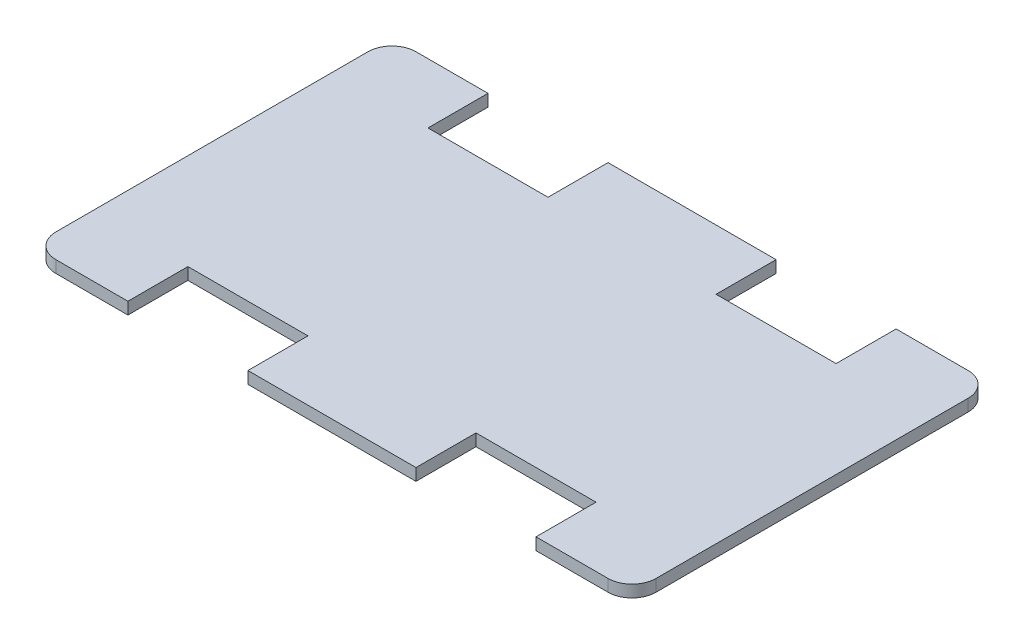
ISO-10303-21;
HEADER;
FILE_DESCRIPTION(('STEP AP214'),'2;1');
FILE_NAME('part.step','',(''),(''),'','','');
FILE_SCHEMA(('AUTOMOTIVE_DESIGN { 1 0 10303 214 1 1 1 1 }'));
ENDSEC;
DATA;
#1=APPLICATION_CONTEXT('core data for automotive mechanical design processes');
#2=APPLICATION_PROTOCOL_DEFINITION('international standard','automotive_design',2000,#1);
#3=PRODUCT_CONTEXT('',#1,'mechanical');
#4=PRODUCT('Part','Part','',(#3));
#5=PRODUCT_RELATED_PRODUCT_CATEGORY('part','',(#4));
#6=PRODUCT_DEFINITION_FORMATION('','',#4);
#7=PRODUCT_DEFINITION_CONTEXT('part definition',#1,'design');
#8=PRODUCT_DEFINITION('design','',#6,#7);
#9=PRODUCT_DEFINITION_SHAPE('','',#8);
#10=(LENGTH_UNIT() NAMED_UNIT(*) SI_UNIT(.MILLI.,.METRE.));
#11=(NAMED_UNIT(*) PLANE_ANGLE_UNIT() SI_UNIT($,.RADIAN.));
#12=(NAMED_UNIT(*) SI_UNIT($,.STERADIAN.) SOLID_ANGLE_UNIT());
#13=UNCERTAINTY_MEASURE_WITH_UNIT(LENGTH_MEASURE(1.E-05),#10,'distance_accuracy_value','');
#14=(GEOMETRIC_REPRESENTATION_CONTEXT(3) GLOBAL_UNCERTAINTY_ASSIGNED_CONTEXT((#13)) GLOBAL_UNIT_ASSIGNED_CONTEXT((#10,
#11,#12)) REPRESENTATION_CONTEXT('',''));
#15=CARTESIAN_POINT('',(0.,0.,0.));
#16=DIRECTION('',(0.,0.,1.));
#17=DIRECTION('',(1.,0.,0.));
#18=AXIS2_PLACEMENT_3D('',#15,#16,#17);
#19=CARTESIAN_POINT('',(-105.729613733906,5.,-57.5107296137339));
#20=DIRECTION('',(-1.,0.,0.));
#21=DIRECTION('',(0.,0.,1.));
#22=AXIS2_PLACEMENT_3D('',#19,#20,#21);
#23=PLANE('',#22);
#24=DIRECTION('',(0.,0.,-1.));
#25=VECTOR('',#24,1.);
#26=CARTESIAN_POINT('',(-105.729613733906,0.,-57.5107296137339));
#27=LINE('',#26,#25);
#28=CARTESIAN_POINT('',(-105.729613733906,0.,-32.5107296137339));
#29=VERTEX_POINT('',#28);
#30=CARTESIAN_POINT('',(-105.729613733906,0.,-57.5107296137339));
#31=VERTEX_POINT('',#30);
#32=EDGE_CURVE('E242',#29,#31,#27,.T.);
#33=ORIENTED_EDGE('',*,*,#32,.T.);
#34=DIRECTION('',(0.,-1.,0.));
#35=VECTOR('',#34,1.);
#36=CARTESIAN_POINT('',(-105.729613733906,5.,-57.5107296137339));
#37=LINE('',#36,#35);
#38=CARTESIAN_POINT('',(-105.729613733906,5.,-57.5107296137339));
#39=VERTEX_POINT('',#38);
#40=EDGE_CURVE('E11',#39,#31,#37,.T.);
#41=ORIENTED_EDGE('',*,*,#40,.F.);
#42=DIRECTION('',(0.,0.,-1.));
#43=VECTOR('',#42,1.);
#44=CARTESIAN_POINT('',(-105.729613733906,5.,-57.5107296137339));
#45=LINE('',#44,#43);
#46=CARTESIAN_POINT('',(-105.729613733906,5.,-32.5107296137339));
#47=VERTEX_POINT('',#46);
#48=EDGE_CURVE('E312',#47,#39,#45,.T.);
#49=ORIENTED_EDGE('',*,*,#48,.F.);
#50=DIRECTION('',(0.,-1.,0.));
#51=VECTOR('',#50,1.);
#52=CARTESIAN_POINT('',(-105.729613733906,5.,-32.5107296137339));
#53=LINE('',#52,#51);
#54=EDGE_CURVE('E238',#47,#29,#53,.T.);
#55=ORIENTED_EDGE('',*,*,#54,.T.);
#56=EDGE_LOOP('',(#33,#41,#49,#55));
#57=FACE_BOUND('',#56,.T.);
#58=ADVANCED_FACE('F45',(#57),#23,.F.);
#59=CARTESIAN_POINT('',(-135.729613733905,5.,-57.5107296137339));
#60=DIRECTION('',(0.,0.,1.));
#61=DIRECTION('',(1.,0.,0.));
#62=AXIS2_PLACEMENT_3D('',#59,#60,#61);
#63=PLANE('',#62);
#64=DIRECTION('',(-1.,0.,0.));
#65=VECTOR('',#64,1.);
#66=CARTESIAN_POINT('',(-135.729613733905,0.,-57.5107296137339));
#67=LINE('',#66,#65);
#68=CARTESIAN_POINT('',(-135.729613733905,0.,-57.5107296137339));
#69=VERTEX_POINT('',#68);
#70=EDGE_CURVE('E246',#31,#69,#67,.T.);
#71=ORIENTED_EDGE('',*,*,#70,.T.);
#72=DIRECTION('',(0.,-1.,0.));
#73=VECTOR('',#72,1.);
#74=CARTESIAN_POINT('',(-135.729613733905,5.,-57.5107296137339));
#75=LINE('',#74,#73);
#76=CARTESIAN_POINT('',(-135.729613733905,5.,-57.5107296137339));
#77=VERTEX_POINT('',#76);
#78=EDGE_CURVE('E54',#77,#69,#75,.T.);
#79=ORIENTED_EDGE('',*,*,#78,.F.);
#80=DIRECTION('',(-1.,0.,0.));
#81=VECTOR('',#80,1.);
#82=CARTESIAN_POINT('',(-135.729613733905,5.,-57.5107296137339));
#83=LINE('',#82,#81);
#84=EDGE_CURVE('E153',#39,#77,#83,.T.);
#85=ORIENTED_EDGE('',*,*,#84,.F.);
#86=ORIENTED_EDGE('',*,*,#40,.T.);
#87=EDGE_LOOP('',(#71,#79,#85,#86));
#88=FACE_BOUND('',#87,.T.);
#89=ADVANCED_FACE('F490',(#88),#63,.F.);
#90=CARTESIAN_POINT('',(-135.729613733906,5.,-47.5107296137339));
#91=DIRECTION('',(0.,-1.,0.));
#92=DIRECTION('',(0.,0.,-1.));
#93=AXIS2_PLACEMENT_3D('',#90,#91,#92);
#94=CYLINDRICAL_SURFACE('',#93,10.);
#95=CARTESIAN_POINT('',(-135.729613733906,0.,-47.5107296137339));
#96=DIRECTION('',(0.,1.,0.));
#97=DIRECTION('',(0.,0.,-1.));
#98=AXIS2_PLACEMENT_3D('',#95,#96,#97);
#99=CIRCLE('',#98,10.);
#100=CARTESIAN_POINT('',(-145.729613733906,0.,-47.5107296137338));
#101=VERTEX_POINT('',#100);
#102=EDGE_CURVE('E249',#69,#101,#99,.T.);
#103=ORIENTED_EDGE('',*,*,#102,.T.);
#104=DIRECTION('',(0.,-1.,0.));
#105=VECTOR('',#104,1.);
#106=CARTESIAN_POINT('',(-145.729613733906,5.,-47.5107296137338));
#107=LINE('',#106,#105);
#108=CARTESIAN_POINT('',(-145.729613733906,5.,-47.5107296137338));
#109=VERTEX_POINT('',#108);
#110=EDGE_CURVE('E387',#109,#101,#107,.T.);
#111=ORIENTED_EDGE('',*,*,#110,.F.);
#112=CARTESIAN_POINT('',(-135.729613733906,5.,-47.5107296137339));
#113=DIRECTION('',(0.,1.,0.));
#114=DIRECTION('',(0.,0.,-1.));
#115=AXIS2_PLACEMENT_3D('',#112,#113,#114);
#116=CIRCLE('',#115,10.);
#117=EDGE_CURVE('E397',#77,#109,#116,.T.);
#118=ORIENTED_EDGE('',*,*,#117,.F.);
#119=ORIENTED_EDGE('',*,*,#78,.T.);
#120=EDGE_LOOP('',(#103,#111,#118,#119));
#121=FACE_BOUND('',#120,.T.);
#122=ADVANCED_FACE('F395',(#121),#94,.T.);
#123=CARTESIAN_POINT('',(-145.729613733906,5.,-47.5107296137339));
#124=DIRECTION('',(1.,0.,0.));
#125=DIRECTION('',(0.,0.,-1.));
#126=AXIS2_PLACEMENT_3D('',#123,#124,#125);
#127=PLANE('',#126);
#128=DIRECTION('',(0.,0.,1.));
#129=VECTOR('',#128,1.);
#130=CARTESIAN_POINT('',(-145.729613733906,0.,-47.5107296137339));
#131=LINE('',#130,#129);
#132=CARTESIAN_POINT('',(-145.729613733906,0.,82.489270386266));
#133=VERTEX_POINT('',#132);
#134=EDGE_CURVE('E252',#101,#133,#131,.T.);
#135=ORIENTED_EDGE('',*,*,#134,.T.);
#136=DIRECTION('',(0.,-1.,0.));
#137=VECTOR('',#136,1.);
#138=CARTESIAN_POINT('',(-145.729613733906,5.,82.489270386266));
#139=LINE('',#138,#137);
#140=CARTESIAN_POINT('',(-145.729613733906,5.,82.489270386266));
#141=VERTEX_POINT('',#140);
#142=EDGE_CURVE('E383',#141,#133,#139,.T.);
#143=ORIENTED_EDGE('',*,*,#142,.F.);
#144=DIRECTION('',(0.,0.,1.));
#145=VECTOR('',#144,1.);
#146=CARTESIAN_POINT('',(-145.729613733906,5.,-47.5107296137339));
#147=LINE('',#146,#145);
#148=EDGE_CURVE('E416',#109,#141,#147,.T.);
#149=ORIENTED_EDGE('',*,*,#148,.F.);
#150=ORIENTED_EDGE('',*,*,#110,.T.);
#151=EDGE_LOOP('',(#135,#143,#149,#150));
#152=FACE_BOUND('',#151,.T.);
#153=ADVANCED_FACE('F406',(#152),#127,.F.);
#154=CARTESIAN_POINT('',(-135.729613733906,5.,82.4892703862661));
#155=DIRECTION('',(0.,-1.,0.));
#156=DIRECTION('',(0.,0.,-1.));
#157=AXIS2_PLACEMENT_3D('',#154,#155,#156);
#158=CYLINDRICAL_SURFACE('',#157,10.);
#159=CARTESIAN_POINT('',(-135.729613733906,0.,82.4892703862661));
#160=DIRECTION('',(0.,1.,0.));
#161=DIRECTION('',(0.,0.,1.));
#162=AXIS2_PLACEMENT_3D('',#159,#160,#161);
#163=CIRCLE('',#162,10.);
#164=CARTESIAN_POINT('',(-135.729613733906,0.,92.4892703862661));
#165=VERTEX_POINT('',#164);
#166=EDGE_CURVE('E255',#133,#165,#163,.T.);
#167=ORIENTED_EDGE('',*,*,#166,.T.);
#168=DIRECTION('',(0.,-1.,0.));
#169=VECTOR('',#168,1.);
#170=CARTESIAN_POINT('',(-135.729613733906,5.,92.4892703862661));
#171=LINE('',#170,#169);
#172=CARTESIAN_POINT('',(-135.729613733906,5.,92.4892703862661));
#173=VERTEX_POINT('',#172);
#174=EDGE_CURVE('E379',#173,#165,#171,.T.);
#175=ORIENTED_EDGE('',*,*,#174,.F.);
#176=CARTESIAN_POINT('',(-135.729613733906,5.,82.4892703862661));
#177=DIRECTION('',(0.,1.,0.));
#178=DIRECTION('',(0.,0.,1.));
#179=AXIS2_PLACEMENT_3D('',#176,#177,#178);
#180=CIRCLE('',#179,10.);
#181=EDGE_CURVE('E412',#141,#173,#180,.T.);
#182=ORIENTED_EDGE('',*,*,#181,.F.);
#183=ORIENTED_EDGE('',*,*,#142,.T.);
#184=EDGE_LOOP('',(#167,#175,#182,#183));
#185=FACE_BOUND('',#184,.T.);
#186=ADVANCED_FACE('F410',(#185),#158,.T.);
#187=CARTESIAN_POINT('',(-135.729613733905,5.,92.4892703862661));
#188=DIRECTION('',(0.,0.,-1.));
#189=DIRECTION('',(-1.,0.,0.));
#190=AXIS2_PLACEMENT_3D('',#187,#188,#189);
#191=PLANE('',#190);
#192=DIRECTION('',(1.,0.,0.));
#193=VECTOR('',#192,1.);
#194=CARTESIAN_POINT('',(-135.729613733905,0.,92.4892703862661));
#195=LINE('',#194,#193);
#196=CARTESIAN_POINT('',(-105.729613733906,0.,92.4892703862661));
#197=VERTEX_POINT('',#196);
#198=EDGE_CURVE('E258',#165,#197,#195,.T.);
#199=ORIENTED_EDGE('',*,*,#198,.T.);
#200=DIRECTION('',(0.,-1.,0.));
#201=VECTOR('',#200,1.);
#202=CARTESIAN_POINT('',(-105.729613733906,5.,92.4892703862661));
#203=LINE('',#202,#201);
#204=CARTESIAN_POINT('',(-105.729613733906,5.,92.4892703862661));
#205=VERTEX_POINT('',#204);
#206=EDGE_CURVE('E375',#205,#197,#203,.T.);
#207=ORIENTED_EDGE('',*,*,#206,.F.);
#208=DIRECTION('',(1.,0.,0.));
#209=VECTOR('',#208,1.);
#210=CARTESIAN_POINT('',(-135.729613733905,5.,92.4892703862661));
#211=LINE('',#210,#209);
#212=EDGE_CURVE('E415',#173,#205,#211,.T.);
#213=ORIENTED_EDGE('',*,*,#212,.F.);
#214=ORIENTED_EDGE('',*,*,#174,.T.);
#215=EDGE_LOOP('',(#199,#207,#213,#214));
#216=FACE_BOUND('',#215,.T.);
#217=ADVANCED_FACE('F503',(#216),#191,.F.);
#218=CARTESIAN_POINT('',(-105.729613733906,5.,67.4892703862661));
#219=DIRECTION('',(-1.,0.,0.));
#220=DIRECTION('',(0.,0.,1.));
#221=AXIS2_PLACEMENT_3D('',#218,#219,#220);
#222=PLANE('',#221);
#223=DIRECTION('',(0.,0.,-1.));
#224=VECTOR('',#223,1.);
#225=CARTESIAN_POINT('',(-105.729613733906,0.,67.4892703862661));
#226=LINE('',#225,#224);
#227=CARTESIAN_POINT('',(-105.729613733906,0.,67.4892703862661));
#228=VERTEX_POINT('',#227);
#229=EDGE_CURVE('E261',#197,#228,#226,.T.);
#230=ORIENTED_EDGE('',*,*,#229,.T.);
#231=DIRECTION('',(0.,-1.,0.));
#232=VECTOR('',#231,1.);
#233=CARTESIAN_POINT('',(-105.729613733906,5.,67.4892703862661));
#234=LINE('',#233,#232);
#235=CARTESIAN_POINT('',(-105.729613733906,5.,67.4892703862661));
#236=VERTEX_POINT('',#235);
#237=EDGE_CURVE('E371',#236,#228,#234,.T.);
#238=ORIENTED_EDGE('',*,*,#237,.F.);
#239=DIRECTION('',(0.,0.,-1.));
#240=VECTOR('',#239,1.);
#241=CARTESIAN_POINT('',(-105.729613733906,5.,67.4892703862661));
#242=LINE('',#241,#240);
#243=EDGE_CURVE('E420',#205,#236,#242,.T.);
#244=ORIENTED_EDGE('',*,*,#243,.F.);
#245=ORIENTED_EDGE('',*,*,#206,.T.);
#246=EDGE_LOOP('',(#230,#238,#244,#245));
#247=FACE_BOUND('',#246,.T.);
#248=ADVANCED_FACE('F506',(#247),#222,.F.);
#249=CARTESIAN_POINT('',(-105.729613733906,5.,67.4892703862661));
#250=DIRECTION('',(0.,0.,-1.));
#251=DIRECTION('',(-1.,0.,0.));
#252=AXIS2_PLACEMENT_3D('',#249,#250,#251);
#253=PLANE('',#252);
#254=DIRECTION('',(1.,0.,0.));
#255=VECTOR('',#254,1.);
#256=CARTESIAN_POINT('',(-105.729613733906,0.,67.4892703862661));
#257=LINE('',#256,#255);
#258=CARTESIAN_POINT('',(-55.7296137339055,0.,67.4892703862661));
#259=VERTEX_POINT('',#258);
#260=EDGE_CURVE('E264',#228,#259,#257,.T.);
#261=ORIENTED_EDGE('',*,*,#260,.T.);
#262=DIRECTION('',(0.,-1.,0.));
#263=VECTOR('',#262,1.);
#264=CARTESIAN_POINT('',(-55.7296137339055,5.,67.4892703862661));
#265=LINE('',#264,#263);
#266=CARTESIAN_POINT('',(-55.7296137339055,5.,67.4892703862661));
#267=VERTEX_POINT('',#266);
#268=EDGE_CURVE('E367',#267,#259,#265,.T.);
#269=ORIENTED_EDGE('',*,*,#268,.F.);
#270=DIRECTION('',(1.,0.,0.));
#271=VECTOR('',#270,1.);
#272=CARTESIAN_POINT('',(-105.729613733906,5.,67.4892703862661));
#273=LINE('',#272,#271);
#274=EDGE_CURVE('E427',#236,#267,#273,.T.);
#275=ORIENTED_EDGE('',*,*,#274,.F.);
#276=ORIENTED_EDGE('',*,*,#237,.T.);
#277=EDGE_LOOP('',(#261,#269,#275,#276));
#278=FACE_BOUND('',#277,.T.);
#279=ADVANCED_FACE('F510',(#278),#253,.F.);
#280=CARTESIAN_POINT('',(-55.7296137339055,5.,67.4892703862661));
#281=DIRECTION('',(1.,0.,0.));
#282=DIRECTION('',(0.,0.,-1.));
#283=AXIS2_PLACEMENT_3D('',#280,#281,#282);
#284=PLANE('',#283);
#285=DIRECTION('',(0.,0.,1.));
#286=VECTOR('',#285,1.);
#287=CARTESIAN_POINT('',(-55.7296137339055,0.,67.4892703862661));
#288=LINE('',#287,#286);
#289=CARTESIAN_POINT('',(-55.7296137339055,0.,92.4892703862661));
#290=VERTEX_POINT('',#289);
#291=EDGE_CURVE('E267',#259,#290,#288,.T.);
#292=ORIENTED_EDGE('',*,*,#291,.T.);
#293=DIRECTION('',(0.,-1.,0.));
#294=VECTOR('',#293,1.);
#295=CARTESIAN_POINT('',(-55.7296137339055,5.,92.4892703862661));
#296=LINE('',#295,#294);
#297=CARTESIAN_POINT('',(-55.7296137339055,5.,92.4892703862661));
#298=VERTEX_POINT('',#297);
#299=EDGE_CURVE('E363',#298,#290,#296,.T.);
#300=ORIENTED_EDGE('',*,*,#299,.F.);
#301=DIRECTION('',(0.,0.,1.));
#302=VECTOR('',#301,1.);
#303=CARTESIAN_POINT('',(-55.7296137339055,5.,67.4892703862661));
#304=LINE('',#303,#302);
#305=EDGE_CURVE('E430',#267,#298,#304,.T.);
#306=ORIENTED_EDGE('',*,*,#305,.F.);
#307=ORIENTED_EDGE('',*,*,#268,.T.);
#308=EDGE_LOOP('',(#292,#300,#306,#307));
#309=FACE_BOUND('',#308,.T.);
#310=ADVANCED_FACE('F514',(#309),#284,.F.);
#311=CARTESIAN_POINT('',(-55.7296137339055,5.,92.4892703862661));
#312=DIRECTION('',(0.,0.,-1.));
#313=DIRECTION('',(-1.,0.,0.));
#314=AXIS2_PLACEMENT_3D('',#311,#312,#313);
#315=PLANE('',#314);
#316=DIRECTION('',(1.,0.,0.));
#317=VECTOR('',#316,1.);
#318=CARTESIAN_POINT('',(-55.7296137339055,0.,92.4892703862661));
#319=LINE('',#318,#317);
#320=CARTESIAN_POINT('',(14.2703862660944,0.,92.4892703862661));
#321=VERTEX_POINT('',#320);
#322=EDGE_CURVE('E270',#290,#321,#319,.T.);
#323=ORIENTED_EDGE('',*,*,#322,.T.);
#324=DIRECTION('',(0.,-1.,0.));
#325=VECTOR('',#324,1.);
#326=CARTESIAN_POINT('',(14.2703862660944,5.,92.4892703862661));
#327=LINE('',#326,#325);
#328=CARTESIAN_POINT('',(14.2703862660944,5.,92.4892703862661));
#329=VERTEX_POINT('',#328);
#330=EDGE_CURVE('E359',#329,#321,#327,.T.);
#331=ORIENTED_EDGE('',*,*,#330,.F.);
#332=DIRECTION('',(1.,0.,0.));
#333=VECTOR('',#332,1.);
#334=CARTESIAN_POINT('',(-55.7296137339055,5.,92.4892703862661));
#335=LINE('',#334,#333);
#336=EDGE_CURVE('E433',#298,#329,#335,.T.);
#337=ORIENTED_EDGE('',*,*,#336,.F.);
#338=ORIENTED_EDGE('',*,*,#299,.T.);
#339=EDGE_LOOP('',(#323,#331,#337,#338));
#340=FACE_BOUND('',#339,.T.);
#341=ADVANCED_FACE('F518',(#340),#315,.F.);
#342=CARTESIAN_POINT('',(14.2703862660944,5.,67.4892703862661));
#343=DIRECTION('',(-1.,0.,0.));
#344=DIRECTION('',(0.,0.,1.));
#345=AXIS2_PLACEMENT_3D('',#342,#343,#344);
#346=PLANE('',#345);
#347=DIRECTION('',(0.,0.,-1.));
#348=VECTOR('',#347,1.);
#349=CARTESIAN_POINT('',(14.2703862660944,0.,67.4892703862661));
#350=LINE('',#349,#348);
#351=CARTESIAN_POINT('',(14.2703862660944,0.,67.4892703862661));
#352=VERTEX_POINT('',#351);
#353=EDGE_CURVE('E273',#321,#352,#350,.T.);
#354=ORIENTED_EDGE('',*,*,#353,.T.);
#355=DIRECTION('',(0.,-1.,0.));
#356=VECTOR('',#355,1.);
#357=CARTESIAN_POINT('',(14.2703862660944,5.,67.4892703862661));
#358=LINE('',#357,#356);
#359=CARTESIAN_POINT('',(14.2703862660944,5.,67.4892703862661));
#360=VERTEX_POINT('',#359);
#361=EDGE_CURVE('E355',#360,#352,#358,.T.);
#362=ORIENTED_EDGE('',*,*,#361,.F.);
#363=DIRECTION('',(0.,0.,-1.));
#364=VECTOR('',#363,1.);
#365=CARTESIAN_POINT('',(14.2703862660944,5.,67.4892703862661));
#366=LINE('',#365,#364);
#367=EDGE_CURVE('E436',#329,#360,#366,.T.);
#368=ORIENTED_EDGE('',*,*,#367,.F.);
#369=ORIENTED_EDGE('',*,*,#330,.T.);
#370=EDGE_LOOP('',(#354,#362,#368,#369));
#371=FACE_BOUND('',#370,.T.);
#372=ADVANCED_FACE('F522',(#371),#346,.F.);
#373=CARTESIAN_POINT('',(14.2703862660944,5.,67.4892703862661));
#374=DIRECTION('',(0.,0.,-1.));
#375=DIRECTION('',(-1.,0.,0.));
#376=AXIS2_PLACEMENT_3D('',#373,#374,#375);
#377=PLANE('',#376);
#378=DIRECTION('',(1.,0.,0.));
#379=VECTOR('',#378,1.);
#380=CARTESIAN_POINT('',(14.2703862660944,0.,67.4892703862661));
#381=LINE('',#380,#379);
#382=CARTESIAN_POINT('',(64.2703862660944,0.,67.4892703862661));
#383=VERTEX_POINT('',#382);
#384=EDGE_CURVE('E276',#352,#383,#381,.T.);
#385=ORIENTED_EDGE('',*,*,#384,.T.);
#386=DIRECTION('',(0.,-1.,0.));
#387=VECTOR('',#386,1.);
#388=CARTESIAN_POINT('',(64.2703862660944,5.,67.4892703862661));
#389=LINE('',#388,#387);
#390=CARTESIAN_POINT('',(64.2703862660944,5.,67.4892703862661));
#391=VERTEX_POINT('',#390);
#392=EDGE_CURVE('E351',#391,#383,#389,.T.);
#393=ORIENTED_EDGE('',*,*,#392,.F.);
#394=DIRECTION('',(1.,0.,0.));
#395=VECTOR('',#394,1.);
#396=CARTESIAN_POINT('',(14.2703862660944,5.,67.4892703862661));
#397=LINE('',#396,#395);
#398=EDGE_CURVE('E439',#360,#391,#397,.T.);
#399=ORIENTED_EDGE('',*,*,#398,.F.);
#400=ORIENTED_EDGE('',*,*,#361,.T.);
#401=EDGE_LOOP('',(#385,#393,#399,#400));
#402=FACE_BOUND('',#401,.T.);
#403=ADVANCED_FACE('F526',(#402),#377,.F.);
#404=CARTESIAN_POINT('',(64.2703862660944,5.,67.4892703862661));
#405=DIRECTION('',(1.,0.,0.));
#406=DIRECTION('',(0.,0.,-1.));
#407=AXIS2_PLACEMENT_3D('',#404,#405,#406);
#408=PLANE('',#407);
#409=DIRECTION('',(0.,0.,1.));
#410=VECTOR('',#409,1.);
#411=CARTESIAN_POINT('',(64.2703862660944,0.,67.4892703862661));
#412=LINE('',#411,#410);
#413=CARTESIAN_POINT('',(64.2703862660944,0.,92.4892703862661));
#414=VERTEX_POINT('',#413);
#415=EDGE_CURVE('E279',#383,#414,#412,.T.);
#416=ORIENTED_EDGE('',*,*,#415,.T.);
#417=DIRECTION('',(0.,-1.,0.));
#418=VECTOR('',#417,1.);
#419=CARTESIAN_POINT('',(64.2703862660944,5.,92.4892703862661));
#420=LINE('',#419,#418);
#421=CARTESIAN_POINT('',(64.2703862660944,5.,92.4892703862661));
#422=VERTEX_POINT('',#421);
#423=EDGE_CURVE('E347',#422,#414,#420,.T.);
#424=ORIENTED_EDGE('',*,*,#423,.F.);
#425=DIRECTION('',(0.,0.,1.));
#426=VECTOR('',#425,1.);
#427=CARTESIAN_POINT('',(64.2703862660944,5.,67.4892703862661));
#428=LINE('',#427,#426);
#429=EDGE_CURVE('E442',#391,#422,#428,.T.);
#430=ORIENTED_EDGE('',*,*,#429,.F.);
#431=ORIENTED_EDGE('',*,*,#392,.T.);
#432=EDGE_LOOP('',(#416,#424,#430,#431));
#433=FACE_BOUND('',#432,.T.);
#434=ADVANCED_FACE('F530',(#433),#408,.F.);
#435=CARTESIAN_POINT('',(64.2703862660944,5.,92.4892703862661));
#436=DIRECTION('',(0.,0.,-1.));
#437=DIRECTION('',(-1.,0.,0.));
#438=AXIS2_PLACEMENT_3D('',#435,#436,#437);
#439=PLANE('',#438);
#440=DIRECTION('',(1.,0.,0.));
#441=VECTOR('',#440,1.);
#442=CARTESIAN_POINT('',(64.2703862660944,0.,92.4892703862661));
#443=LINE('',#442,#441);
#444=CARTESIAN_POINT('',(94.2703862660943,0.,92.4892703862661));
#445=VERTEX_POINT('',#444);
#446=EDGE_CURVE('E282',#414,#445,#443,.T.);
#447=ORIENTED_EDGE('',*,*,#446,.T.);
#448=DIRECTION('',(0.,-1.,0.));
#449=VECTOR('',#448,1.);
#450=CARTESIAN_POINT('',(94.2703862660943,5.,92.4892703862661));
#451=LINE('',#450,#449);
#452=CARTESIAN_POINT('',(94.2703862660943,5.,92.4892703862661));
#453=VERTEX_POINT('',#452);
#454=EDGE_CURVE('E343',#453,#445,#451,.T.);
#455=ORIENTED_EDGE('',*,*,#454,.F.);
#456=DIRECTION('',(1.,0.,0.));
#457=VECTOR('',#456,1.);
#458=CARTESIAN_POINT('',(64.2703862660944,5.,92.4892703862661));
#459=LINE('',#458,#457);
#460=EDGE_CURVE('E445',#422,#453,#459,.T.);
#461=ORIENTED_EDGE('',*,*,#460,.F.);
#462=ORIENTED_EDGE('',*,*,#423,.T.);
#463=EDGE_LOOP('',(#447,#455,#461,#462));
#464=FACE_BOUND('',#463,.T.);
#465=ADVANCED_FACE('F534',(#464),#439,.F.);
#466=CARTESIAN_POINT('',(94.2703862660944,5.,82.4892703862661));
#467=DIRECTION('',(0.,-1.,0.));
#468=DIRECTION('',(0.,0.,-1.));
#469=AXIS2_PLACEMENT_3D('',#466,#467,#468);
#470=CYLINDRICAL_SURFACE('',#469,10.);
#471=CARTESIAN_POINT('',(94.2703862660944,0.,82.4892703862661));
#472=DIRECTION('',(0.,1.,0.));
#473=DIRECTION('',(0.,0.,1.));
#474=AXIS2_PLACEMENT_3D('',#471,#472,#473);
#475=CIRCLE('',#474,10.);
#476=CARTESIAN_POINT('',(104.270386266094,0.,82.489270386266));
#477=VERTEX_POINT('',#476);
#478=EDGE_CURVE('E285',#445,#477,#475,.T.);
#479=ORIENTED_EDGE('',*,*,#478,.T.);
#480=DIRECTION('',(0.,-1.,0.));
#481=VECTOR('',#480,1.);
#482=CARTESIAN_POINT('',(104.270386266094,5.,82.489270386266));
#483=LINE('',#482,#481);
#484=CARTESIAN_POINT('',(104.270386266094,5.,82.489270386266));
#485=VERTEX_POINT('',#484);
#486=EDGE_CURVE('E339',#485,#477,#483,.T.);
#487=ORIENTED_EDGE('',*,*,#486,.F.);
#488=CARTESIAN_POINT('',(94.2703862660944,5.,82.4892703862661));
#489=DIRECTION('',(0.,1.,0.));
#490=DIRECTION('',(0.,0.,1.));
#491=AXIS2_PLACEMENT_3D('',#488,#489,#490);
#492=CIRCLE('',#491,10.);
#493=EDGE_CURVE('E448',#453,#485,#492,.T.);
#494=ORIENTED_EDGE('',*,*,#493,.F.);
#495=ORIENTED_EDGE('',*,*,#454,.T.);
#496=EDGE_LOOP('',(#479,#487,#494,#495));
#497=FACE_BOUND('',#496,.T.);
#498=ADVANCED_FACE('F538',(#497),#470,.T.);
#499=CARTESIAN_POINT('',(104.270386266094,5.,-47.5107296137339));
#500=DIRECTION('',(-1.,0.,0.));
#501=DIRECTION('',(0.,0.,1.));
#502=AXIS2_PLACEMENT_3D('',#499,#500,#501);
#503=PLANE('',#502);
#504=DIRECTION('',(0.,0.,-1.));
#505=VECTOR('',#504,1.);
#506=CARTESIAN_POINT('',(104.270386266094,0.,-47.5107296137339));
#507=LINE('',#506,#505);
#508=CARTESIAN_POINT('',(104.270386266094,0.,-47.5107296137339));
#509=VERTEX_POINT('',#508);
#510=EDGE_CURVE('E288',#477,#509,#507,.T.);
#511=ORIENTED_EDGE('',*,*,#510,.T.);
#512=DIRECTION('',(0.,-1.,0.));
#513=VECTOR('',#512,1.);
#514=CARTESIAN_POINT('',(104.270386266094,5.,-47.5107296137339));
#515=LINE('',#514,#513);
#516=CARTESIAN_POINT('',(104.270386266094,5.,-47.5107296137339));
#517=VERTEX_POINT('',#516);
#518=EDGE_CURVE('E335',#517,#509,#515,.T.);
#519=ORIENTED_EDGE('',*,*,#518,.F.);
#520=DIRECTION('',(0.,0.,-1.));
#521=VECTOR('',#520,1.);
#522=CARTESIAN_POINT('',(104.270386266094,5.,-47.5107296137339));
#523=LINE('',#522,#521);
#524=EDGE_CURVE('E451',#485,#517,#523,.T.);
#525=ORIENTED_EDGE('',*,*,#524,.F.);
#526=ORIENTED_EDGE('',*,*,#486,.T.);
#527=EDGE_LOOP('',(#511,#519,#525,#526));
#528=FACE_BOUND('',#527,.T.);
#529=ADVANCED_FACE('F542',(#528),#503,.F.);
#530=CARTESIAN_POINT('',(94.2703862660944,5.,-47.510729613734));
#531=DIRECTION('',(0.,-1.,0.));
#532=DIRECTION('',(0.,0.,-1.));
#533=AXIS2_PLACEMENT_3D('',#530,#531,#532);
#534=CYLINDRICAL_SURFACE('',#533,10.);
#535=CARTESIAN_POINT('',(94.2703862660944,0.,-47.510729613734));
#536=DIRECTION('',(0.,1.,0.));
#537=DIRECTION('',(0.,0.,-1.));
#538=AXIS2_PLACEMENT_3D('',#535,#536,#537);
#539=CIRCLE('',#538,10.);
#540=CARTESIAN_POINT('',(94.2703862660943,0.,-57.510729613734));
#541=VERTEX_POINT('',#540);
#542=EDGE_CURVE('E291',#509,#541,#539,.T.);
#543=ORIENTED_EDGE('',*,*,#542,.T.);
#544=DIRECTION('',(0.,-1.,0.));
#545=VECTOR('',#544,1.);
#546=CARTESIAN_POINT('',(94.2703862660943,5.,-57.510729613734));
#547=LINE('',#546,#545);
#548=CARTESIAN_POINT('',(94.2703862660943,5.,-57.510729613734));
#549=VERTEX_POINT('',#548);
#550=EDGE_CURVE('E331',#549,#541,#547,.T.);
#551=ORIENTED_EDGE('',*,*,#550,.F.);
#552=CARTESIAN_POINT('',(94.2703862660944,5.,-47.510729613734));
#553=DIRECTION('',(0.,1.,0.));
#554=DIRECTION('',(0.,0.,-1.));
#555=AXIS2_PLACEMENT_3D('',#552,#553,#554);
#556=CIRCLE('',#555,10.);
#557=EDGE_CURVE('E454',#517,#549,#556,.T.);
#558=ORIENTED_EDGE('',*,*,#557,.F.);
#559=ORIENTED_EDGE('',*,*,#518,.T.);
#560=EDGE_LOOP('',(#543,#551,#558,#559));
#561=FACE_BOUND('',#560,.T.);
#562=ADVANCED_FACE('F546',(#561),#534,.T.);
#563=CARTESIAN_POINT('',(64.2703862660944,5.,-57.5107296137339));
#564=DIRECTION('',(0.,0.,1.));
#565=DIRECTION('',(1.,0.,0.));
#566=AXIS2_PLACEMENT_3D('',#563,#564,#565);
#567=PLANE('',#566);
#568=DIRECTION('',(-1.,0.,0.));
#569=VECTOR('',#568,1.);
#570=CARTESIAN_POINT('',(64.2703862660944,0.,-57.5107296137339));
#571=LINE('',#570,#569);
#572=CARTESIAN_POINT('',(64.2703862660944,0.,-57.5107296137339));
#573=VERTEX_POINT('',#572);
#574=EDGE_CURVE('E294',#541,#573,#571,.T.);
#575=ORIENTED_EDGE('',*,*,#574,.T.);
#576=DIRECTION('',(0.,-1.,0.));
#577=VECTOR('',#576,1.);
#578=CARTESIAN_POINT('',(64.2703862660944,5.,-57.5107296137339));
#579=LINE('',#578,#577);
#580=CARTESIAN_POINT('',(64.2703862660944,5.,-57.5107296137339));
#581=VERTEX_POINT('',#580);
#582=EDGE_CURVE('E327',#581,#573,#579,.T.);
#583=ORIENTED_EDGE('',*,*,#582,.F.);
#584=DIRECTION('',(-1.,0.,0.));
#585=VECTOR('',#584,1.);
#586=CARTESIAN_POINT('',(64.2703862660944,5.,-57.5107296137339));
#587=LINE('',#586,#585);
#588=EDGE_CURVE('E457',#549,#581,#587,.T.);
#589=ORIENTED_EDGE('',*,*,#588,.F.);
#590=ORIENTED_EDGE('',*,*,#550,.T.);
#591=EDGE_LOOP('',(#575,#583,#589,#590));
#592=FACE_BOUND('',#591,.T.);
#593=ADVANCED_FACE('F550',(#592),#567,.F.);
#594=CARTESIAN_POINT('',(64.2703862660944,5.,-57.5107296137339));
#595=DIRECTION('',(1.,0.,0.));
#596=DIRECTION('',(0.,0.,-1.));
#597=AXIS2_PLACEMENT_3D('',#594,#595,#596);
#598=PLANE('',#597);
#599=DIRECTION('',(0.,0.,1.));
#600=VECTOR('',#599,1.);
#601=CARTESIAN_POINT('',(64.2703862660944,0.,-57.5107296137339));
#602=LINE('',#601,#600);
#603=CARTESIAN_POINT('',(64.2703862660944,0.,-32.5107296137339));
#604=VERTEX_POINT('',#603);
#605=EDGE_CURVE('E297',#573,#604,#602,.T.);
#606=ORIENTED_EDGE('',*,*,#605,.T.);
#607=DIRECTION('',(0.,-1.,0.));
#608=VECTOR('',#607,1.);
#609=CARTESIAN_POINT('',(64.2703862660944,5.,-32.5107296137339));
#610=LINE('',#609,#608);
#611=CARTESIAN_POINT('',(64.2703862660944,5.,-32.5107296137339));
#612=VERTEX_POINT('',#611);
#613=EDGE_CURVE('E323',#612,#604,#610,.T.);
#614=ORIENTED_EDGE('',*,*,#613,.F.);
#615=DIRECTION('',(0.,0.,1.));
#616=VECTOR('',#615,1.);
#617=CARTESIAN_POINT('',(64.2703862660944,5.,-57.5107296137339));
#618=LINE('',#617,#616);
#619=EDGE_CURVE('E460',#581,#612,#618,.T.);
#620=ORIENTED_EDGE('',*,*,#619,.F.);
#621=ORIENTED_EDGE('',*,*,#582,.T.);
#622=EDGE_LOOP('',(#606,#614,#620,#621));
#623=FACE_BOUND('',#622,.T.);
#624=ADVANCED_FACE('F554',(#623),#598,.F.);
#625=CARTESIAN_POINT('',(14.2703862660944,5.,-32.5107296137339));
#626=DIRECTION('',(0.,0.,1.));
#627=DIRECTION('',(1.,0.,0.));
#628=AXIS2_PLACEMENT_3D('',#625,#626,#627);
#629=PLANE('',#628);
#630=DIRECTION('',(-1.,0.,0.));
#631=VECTOR('',#630,1.);
#632=CARTESIAN_POINT('',(14.2703862660944,0.,-32.5107296137339));
#633=LINE('',#632,#631);
#634=CARTESIAN_POINT('',(14.2703862660944,0.,-32.5107296137339));
#635=VERTEX_POINT('',#634);
#636=EDGE_CURVE('E300',#604,#635,#633,.T.);
#637=ORIENTED_EDGE('',*,*,#636,.T.);
#638=DIRECTION('',(0.,-1.,0.));
#639=VECTOR('',#638,1.);
#640=CARTESIAN_POINT('',(14.2703862660944,5.,-32.5107296137339));
#641=LINE('',#640,#639);
#642=CARTESIAN_POINT('',(14.2703862660944,5.,-32.5107296137339));
#643=VERTEX_POINT('',#642);
#644=EDGE_CURVE('E319',#643,#635,#641,.T.);
#645=ORIENTED_EDGE('',*,*,#644,.F.);
#646=DIRECTION('',(-1.,0.,0.));
#647=VECTOR('',#646,1.);
#648=CARTESIAN_POINT('',(14.2703862660944,5.,-32.5107296137339));
#649=LINE('',#648,#647);
#650=EDGE_CURVE('E463',#612,#643,#649,.T.);
#651=ORIENTED_EDGE('',*,*,#650,.F.);
#652=ORIENTED_EDGE('',*,*,#613,.T.);
#653=EDGE_LOOP('',(#637,#645,#651,#652));
#654=FACE_BOUND('',#653,.T.);
#655=ADVANCED_FACE('F471',(#654),#629,.F.);
#656=CARTESIAN_POINT('',(14.2703862660944,5.,-57.5107296137339));
#657=DIRECTION('',(-1.,0.,0.));
#658=DIRECTION('',(0.,0.,1.));
#659=AXIS2_PLACEMENT_3D('',#656,#657,#658);
#660=PLANE('',#659);
#661=DIRECTION('',(0.,0.,-1.));
#662=VECTOR('',#661,1.);
#663=CARTESIAN_POINT('',(14.2703862660944,0.,-57.5107296137339));
#664=LINE('',#663,#662);
#665=CARTESIAN_POINT('',(14.2703862660944,0.,-57.5107296137339));
#666=VERTEX_POINT('',#665);
#667=EDGE_CURVE('E303',#635,#666,#664,.T.);
#668=ORIENTED_EDGE('',*,*,#667,.T.);
#669=DIRECTION('',(0.,-1.,0.));
#670=VECTOR('',#669,1.);
#671=CARTESIAN_POINT('',(14.2703862660944,5.,-57.5107296137339));
#672=LINE('',#671,#670);
#673=CARTESIAN_POINT('',(14.2703862660944,5.,-57.5107296137339));
#674=VERTEX_POINT('',#673);
#675=EDGE_CURVE('E231',#674,#666,#672,.T.);
#676=ORIENTED_EDGE('',*,*,#675,.F.);
#677=DIRECTION('',(0.,0.,-1.));
#678=VECTOR('',#677,1.);
#679=CARTESIAN_POINT('',(14.2703862660944,5.,-57.5107296137339));
#680=LINE('',#679,#678);
#681=EDGE_CURVE('E220',#643,#674,#680,.T.);
#682=ORIENTED_EDGE('',*,*,#681,.F.);
#683=ORIENTED_EDGE('',*,*,#644,.T.);
#684=EDGE_LOOP('',(#668,#676,#682,#683));
#685=FACE_BOUND('',#684,.T.);
#686=ADVANCED_FACE('F475',(#685),#660,.F.);
#687=CARTESIAN_POINT('',(-55.7296137339055,5.,-57.5107296137339));
#688=DIRECTION('',(0.,0.,1.));
#689=DIRECTION('',(1.,0.,0.));
#690=AXIS2_PLACEMENT_3D('',#687,#688,#689);
#691=PLANE('',#690);
#692=DIRECTION('',(-1.,0.,0.));
#693=VECTOR('',#692,1.);
#694=CARTESIAN_POINT('',(-55.7296137339055,0.,-57.5107296137339));
#695=LINE('',#694,#693);
#696=CARTESIAN_POINT('',(-55.7296137339055,0.,-57.5107296137339));
#697=VERTEX_POINT('',#696);
#698=EDGE_CURVE('E229',#666,#697,#695,.T.);
#699=ORIENTED_EDGE('',*,*,#698,.T.);
#700=DIRECTION('',(0.,-1.,0.));
#701=VECTOR('',#700,1.);
#702=CARTESIAN_POINT('',(-55.7296137339055,5.,-57.5107296137339));
#703=LINE('',#702,#701);
#704=CARTESIAN_POINT('',(-55.7296137339055,5.,-57.5107296137339));
#705=VERTEX_POINT('',#704);
#706=EDGE_CURVE('E226',#705,#697,#703,.T.);
#707=ORIENTED_EDGE('',*,*,#706,.F.);
#708=DIRECTION('',(-1.,0.,0.));
#709=VECTOR('',#708,1.);
#710=CARTESIAN_POINT('',(-55.7296137339055,5.,-57.5107296137339));
#711=LINE('',#710,#709);
#712=EDGE_CURVE('E214',#674,#705,#711,.T.);
#713=ORIENTED_EDGE('',*,*,#712,.F.);
#714=ORIENTED_EDGE('',*,*,#675,.T.);
#715=EDGE_LOOP('',(#699,#707,#713,#714));
#716=FACE_BOUND('',#715,.T.);
#717=ADVANCED_FACE('F227',(#716),#691,.F.);
#718=CARTESIAN_POINT('',(-55.7296137339055,5.,-57.5107296137339));
#719=DIRECTION('',(1.,0.,0.));
#720=DIRECTION('',(0.,0.,-1.));
#721=AXIS2_PLACEMENT_3D('',#718,#719,#720);
#722=PLANE('',#721);
#723=DIRECTION('',(0.,0.,1.));
#724=VECTOR('',#723,1.);
#725=CARTESIAN_POINT('',(-55.7296137339055,0.,-57.5107296137339));
#726=LINE('',#725,#724);
#727=CARTESIAN_POINT('',(-55.7296137339055,0.,-32.5107296137339));
#728=VERTEX_POINT('',#727);
#729=EDGE_CURVE('E139',#697,#728,#726,.T.);
#730=ORIENTED_EDGE('',*,*,#729,.T.);
#731=DIRECTION('',(0.,-1.,0.));
#732=VECTOR('',#731,1.);
#733=CARTESIAN_POINT('',(-55.7296137339055,5.,-32.5107296137339));
#734=LINE('',#733,#732);
#735=CARTESIAN_POINT('',(-55.7296137339055,5.,-32.5107296137339));
#736=VERTEX_POINT('',#735);
#737=EDGE_CURVE('E232',#736,#728,#734,.T.);
#738=ORIENTED_EDGE('',*,*,#737,.F.);
#739=DIRECTION('',(0.,0.,1.));
#740=VECTOR('',#739,1.);
#741=CARTESIAN_POINT('',(-55.7296137339055,5.,-57.5107296137339));
#742=LINE('',#741,#740);
#743=EDGE_CURVE('E218',#705,#736,#742,.T.);
#744=ORIENTED_EDGE('',*,*,#743,.F.);
#745=ORIENTED_EDGE('',*,*,#706,.T.);
#746=EDGE_LOOP('',(#730,#738,#744,#745));
#747=FACE_BOUND('',#746,.T.);
#748=ADVANCED_FACE('F234',(#747),#722,.F.);
#749=CARTESIAN_POINT('',(-105.729613733906,5.,-32.5107296137339));
#750=DIRECTION('',(0.,0.,1.));
#751=DIRECTION('',(1.,0.,0.));
#752=AXIS2_PLACEMENT_3D('',#749,#750,#751);
#753=PLANE('',#752);
#754=DIRECTION('',(-1.,0.,0.));
#755=VECTOR('',#754,1.);
#756=CARTESIAN_POINT('',(-105.729613733906,0.,-32.5107296137339));
#757=LINE('',#756,#755);
#758=EDGE_CURVE('E145',#728,#29,#757,.T.);
#759=ORIENTED_EDGE('',*,*,#758,.T.);
#760=ORIENTED_EDGE('',*,*,#54,.F.);
#761=DIRECTION('',(-1.,0.,0.));
#762=VECTOR('',#761,1.);
#763=CARTESIAN_POINT('',(-105.729613733906,5.,-32.5107296137339));
#764=LINE('',#763,#762);
#765=EDGE_CURVE('E62',#736,#47,#764,.T.);
#766=ORIENTED_EDGE('',*,*,#765,.F.);
#767=ORIENTED_EDGE('',*,*,#737,.T.);
#768=EDGE_LOOP('',(#759,#760,#766,#767));
#769=FACE_BOUND('',#768,.T.);
#770=ADVANCED_FACE('F479',(#769),#753,.F.);
#771=CARTESIAN_POINT('',(94.2703862660944,5.,-47.510729613734));
#772=DIRECTION('',(0.,-1.,0.));
#773=DIRECTION('',(0.,0.,-1.));
#774=AXIS2_PLACEMENT_3D('',#771,#772,#773);
#775=PLANE('',#774);
#776=ORIENTED_EDGE('',*,*,#48,.T.);
#777=ORIENTED_EDGE('',*,*,#84,.T.);
#778=ORIENTED_EDGE('',*,*,#117,.T.);
#779=ORIENTED_EDGE('',*,*,#148,.T.);
#780=ORIENTED_EDGE('',*,*,#181,.T.);
#781=ORIENTED_EDGE('',*,*,#212,.T.);
#782=ORIENTED_EDGE('',*,*,#243,.T.);
#783=ORIENTED_EDGE('',*,*,#274,.T.);
#784=ORIENTED_EDGE('',*,*,#305,.T.);
#785=ORIENTED_EDGE('',*,*,#336,.T.);
#786=ORIENTED_EDGE('',*,*,#367,.T.);
#787=ORIENTED_EDGE('',*,*,#398,.T.);
#788=ORIENTED_EDGE('',*,*,#429,.T.);
#789=ORIENTED_EDGE('',*,*,#460,.T.);
#790=ORIENTED_EDGE('',*,*,#493,.T.);
#791=ORIENTED_EDGE('',*,*,#524,.T.);
#792=ORIENTED_EDGE('',*,*,#557,.T.);
#793=ORIENTED_EDGE('',*,*,#588,.T.);
#794=ORIENTED_EDGE('',*,*,#619,.T.);
#795=ORIENTED_EDGE('',*,*,#650,.T.);
#796=ORIENTED_EDGE('',*,*,#681,.T.);
#797=ORIENTED_EDGE('',*,*,#712,.T.);
#798=ORIENTED_EDGE('',*,*,#743,.T.);
#799=ORIENTED_EDGE('',*,*,#765,.T.);
#800=EDGE_LOOP('',(#776,#777,#778,#779,#780,#781,#782,#783,#784,#785,#786,#787,#788,#789,#790,
#791,#792,#793,#794,#795,#796,#797,#798,#799));
#801=FACE_BOUND('',#800,.T.);
#802=ADVANCED_FACE('F216',(#801),#775,.F.);
#803=CARTESIAN_POINT('',(94.2703862660944,0.,-47.510729613734));
#804=DIRECTION('',(0.,-1.,0.));
#805=DIRECTION('',(0.,0.,-1.));
#806=AXIS2_PLACEMENT_3D('',#803,#804,#805);
#807=PLANE('',#806);
#808=ORIENTED_EDGE('',*,*,#32,.F.);
#809=ORIENTED_EDGE('',*,*,#758,.F.);
#810=ORIENTED_EDGE('',*,*,#729,.F.);
#811=ORIENTED_EDGE('',*,*,#698,.F.);
#812=ORIENTED_EDGE('',*,*,#667,.F.);
#813=ORIENTED_EDGE('',*,*,#636,.F.);
#814=ORIENTED_EDGE('',*,*,#605,.F.);
#815=ORIENTED_EDGE('',*,*,#574,.F.);
#816=ORIENTED_EDGE('',*,*,#542,.F.);
#817=ORIENTED_EDGE('',*,*,#510,.F.);
#818=ORIENTED_EDGE('',*,*,#478,.F.);
#819=ORIENTED_EDGE('',*,*,#446,.F.);
#820=ORIENTED_EDGE('',*,*,#415,.F.);
#821=ORIENTED_EDGE('',*,*,#384,.F.);
#822=ORIENTED_EDGE('',*,*,#353,.F.);
#823=ORIENTED_EDGE('',*,*,#322,.F.);
#824=ORIENTED_EDGE('',*,*,#291,.F.);
#825=ORIENTED_EDGE('',*,*,#260,.F.);
#826=ORIENTED_EDGE('',*,*,#229,.F.);
#827=ORIENTED_EDGE('',*,*,#198,.F.);
#828=ORIENTED_EDGE('',*,*,#166,.F.);
#829=ORIENTED_EDGE('',*,*,#134,.F.);
#830=ORIENTED_EDGE('',*,*,#102,.F.);
#831=ORIENTED_EDGE('',*,*,#70,.F.);
#832=EDGE_LOOP('',(#808,#809,#810,#811,#812,#813,#814,#815,#816,#817,#818,#819,#820,#821,#822,
#823,#824,#825,#826,#827,#828,#829,#830,#831));
#833=FACE_BOUND('',#832,.T.);
#834=ADVANCED_FACE('F401',(#833),#807,.T.);
#835=CLOSED_SHELL('',(#58,#89,#122,#153,#186,#217,#248,#279,#310,#341,#372,#403,#434,#465,#498,
#529,#562,#593,#624,#655,#686,#717,#748,#770,#802,#834));
#836=MANIFOLD_SOLID_BREP('B2',#835);
#837=ADVANCED_BREP_SHAPE_REPRESENTATION('',(#18,#836),#14);
#838=SHAPE_DEFINITION_REPRESENTATION(#9,#837);
ENDSEC;
END-ISO-10303-21;
